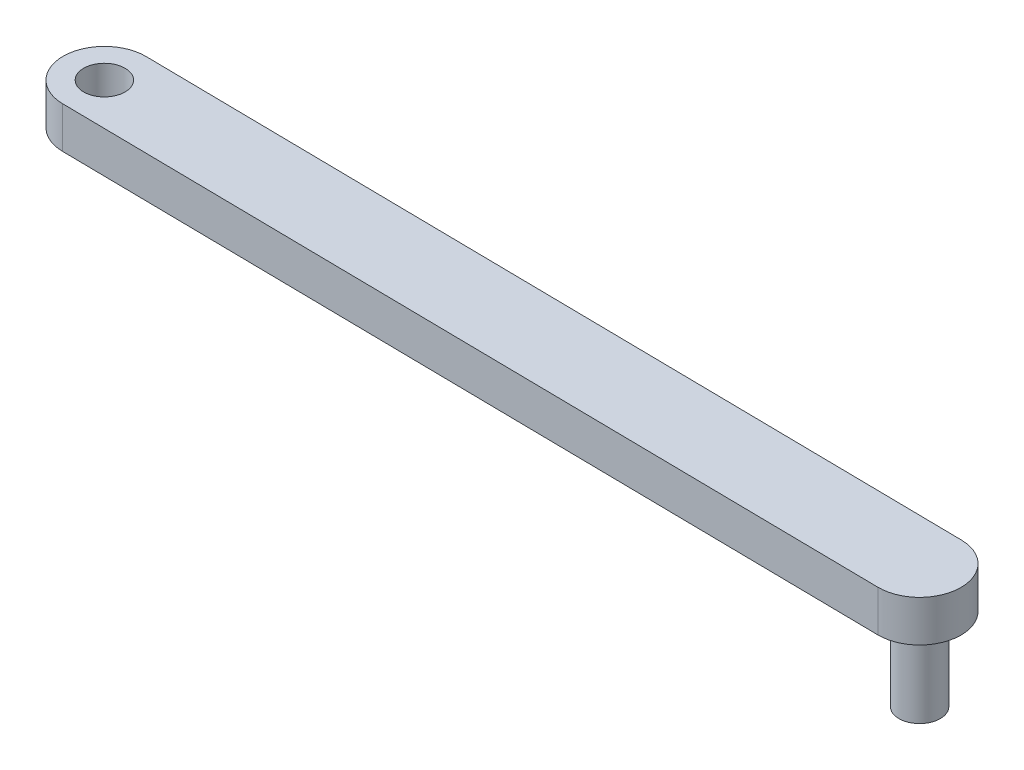
ISO-10303-21;
HEADER;
FILE_DESCRIPTION(('STEP AP214'),'2;1');
FILE_NAME('part.step','',(''),(''),'','','');
FILE_SCHEMA(('AUTOMOTIVE_DESIGN { 1 0 10303 214 1 1 1 1 }'));
ENDSEC;
DATA;
#1=APPLICATION_CONTEXT('core data for automotive mechanical design processes');
#2=APPLICATION_PROTOCOL_DEFINITION('international standard','automotive_design',2000,#1);
#3=PRODUCT_CONTEXT('',#1,'mechanical');
#4=PRODUCT('Part','Part','',(#3));
#5=PRODUCT_RELATED_PRODUCT_CATEGORY('part','',(#4));
#6=PRODUCT_DEFINITION_FORMATION('','',#4);
#7=PRODUCT_DEFINITION_CONTEXT('part definition',#1,'design');
#8=PRODUCT_DEFINITION('design','',#6,#7);
#9=PRODUCT_DEFINITION_SHAPE('','',#8);
#10=(LENGTH_UNIT() NAMED_UNIT(*) SI_UNIT(.MILLI.,.METRE.));
#11=(NAMED_UNIT(*) PLANE_ANGLE_UNIT() SI_UNIT($,.RADIAN.));
#12=(NAMED_UNIT(*) SI_UNIT($,.STERADIAN.) SOLID_ANGLE_UNIT());
#13=UNCERTAINTY_MEASURE_WITH_UNIT(LENGTH_MEASURE(1.E-05),#10,'distance_accuracy_value','');
#14=(GEOMETRIC_REPRESENTATION_CONTEXT(3) GLOBAL_UNCERTAINTY_ASSIGNED_CONTEXT((#13)) GLOBAL_UNIT_ASSIGNED_CONTEXT((#10,
#11,#12)) REPRESENTATION_CONTEXT('',''));
#15=CARTESIAN_POINT('',(0.,0.,0.));
#16=DIRECTION('',(0.,0.,1.));
#17=DIRECTION('',(1.,0.,0.));
#18=AXIS2_PLACEMENT_3D('',#15,#16,#17);
#19=CARTESIAN_POINT('',(-14.5716160355899,5.,-1.70714880270089));
#20=DIRECTION('',(0.,1.,0.));
#21=DIRECTION('',(0.,0.,1.));
#22=AXIS2_PLACEMENT_3D('',#19,#20,#21);
#23=PLANE('',#22);
#24=CARTESIAN_POINT('',(-14.5716160355899,5.,-1.70714880270089));
#25=DIRECTION('',(0.,1.,0.));
#26=DIRECTION('',(0.,0.,1.));
#27=AXIS2_PLACEMENT_3D('',#24,#25,#26);
#28=CIRCLE('',#27,5.);
#29=CARTESIAN_POINT('',(-14.5044435953561,5.,-6.70669756866698));
#30=VERTEX_POINT('',#29);
#31=CARTESIAN_POINT('',(-14.6387884758236,5.,3.2923999632652));
#32=VERTEX_POINT('',#31);
#33=EDGE_CURVE('E86',#30,#32,#28,.T.);
#34=ORIENTED_EDGE('',*,*,#33,.T.);
#35=DIRECTION('',(0.999909753193218,0.,0.013434488046742));
#36=VECTOR('',#35,1.);
#37=CARTESIAN_POINT('',(-14.6387884758236,5.,3.2923999632652));
#38=LINE('',#37,#36);
#39=CARTESIAN_POINT('',(85.3612115241764,5.,4.63597002084679));
#40=VERTEX_POINT('',#39);
#41=EDGE_CURVE('E81',#32,#40,#38,.T.);
#42=ORIENTED_EDGE('',*,*,#41,.T.);
#43=CARTESIAN_POINT('',(85.4283839644101,5.,-0.363578745119304));
#44=DIRECTION('',(0.,1.,0.));
#45=DIRECTION('',(0.,0.,1.));
#46=AXIS2_PLACEMENT_3D('',#43,#44,#45);
#47=CIRCLE('',#46,5.);
#48=CARTESIAN_POINT('',(85.4955564046439,5.,-5.36312751108539));
#49=VERTEX_POINT('',#48);
#50=EDGE_CURVE('E84',#40,#49,#47,.T.);
#51=ORIENTED_EDGE('',*,*,#50,.T.);
#52=DIRECTION('',(-0.999909753193218,0.,-0.013434488046742));
#53=VECTOR('',#52,1.);
#54=CARTESIAN_POINT('',(-14.5044435953561,5.,-6.70669756866698));
#55=LINE('',#54,#53);
#56=EDGE_CURVE('E51',#49,#30,#55,.T.);
#57=ORIENTED_EDGE('',*,*,#56,.T.);
#58=EDGE_LOOP('',(#34,#42,#51,#57));
#59=FACE_BOUND('',#58,.T.);
#60=CARTESIAN_POINT('',(-14.5716160355899,5.,-1.70714880270089));
#61=DIRECTION('',(0.,1.,0.));
#62=DIRECTION('',(0.,0.,1.));
#63=AXIS2_PLACEMENT_3D('',#60,#61,#62);
#64=CIRCLE('',#63,2.5);
#65=CARTESIAN_POINT('',(-14.5716160355899,5.,0.792851197299112));
#66=VERTEX_POINT('',#65);
#67=EDGE_CURVE('E102',#66,#66,#64,.T.);
#68=ORIENTED_EDGE('',*,*,#67,.F.);
#69=EDGE_LOOP('',(#68));
#70=FACE_BOUND('',#69,.T.);
#71=ADVANCED_FACE('F33',(#59,#70),#23,.T.);
#72=CARTESIAN_POINT('',(-14.5716160355899,0.,-1.70714880270089));
#73=DIRECTION('',(0.,1.,0.));
#74=DIRECTION('',(0.,0.,1.));
#75=AXIS2_PLACEMENT_3D('',#72,#73,#74);
#76=PLANE('',#75);
#77=CARTESIAN_POINT('',(85.4283839644101,0.,-0.3635787451193));
#78=DIRECTION('',(0.,1.,0.));
#79=DIRECTION('',(0.,0.,1.));
#80=AXIS2_PLACEMENT_3D('',#77,#78,#79);
#81=CIRCLE('',#80,2.50000000000001);
#82=CARTESIAN_POINT('',(85.4283839644101,0.,2.13642125488071));
#83=VERTEX_POINT('',#82);
#84=EDGE_CURVE('E37',#83,#83,#81,.T.);
#85=ORIENTED_EDGE('',*,*,#84,.T.);
#86=EDGE_LOOP('',(#85));
#87=FACE_BOUND('',#86,.T.);
#88=CARTESIAN_POINT('',(-14.5716160355899,0.,-1.70714880270089));
#89=DIRECTION('',(0.,1.,0.));
#90=DIRECTION('',(0.,0.,1.));
#91=AXIS2_PLACEMENT_3D('',#88,#89,#90);
#92=CIRCLE('',#91,5.);
#93=CARTESIAN_POINT('',(-14.5044435953561,0.,-6.70669756866698));
#94=VERTEX_POINT('',#93);
#95=CARTESIAN_POINT('',(-14.6387884758236,0.,3.2923999632652));
#96=VERTEX_POINT('',#95);
#97=EDGE_CURVE('E99',#94,#96,#92,.T.);
#98=ORIENTED_EDGE('',*,*,#97,.F.);
#99=DIRECTION('',(-0.999909753193218,0.,-0.013434488046742));
#100=VECTOR('',#99,1.);
#101=CARTESIAN_POINT('',(-14.5044435953561,0.,-6.70669756866698));
#102=LINE('',#101,#100);
#103=CARTESIAN_POINT('',(85.4955564046439,0.,-5.36312751108539));
#104=VERTEX_POINT('',#103);
#105=EDGE_CURVE('E74',#104,#94,#102,.T.);
#106=ORIENTED_EDGE('',*,*,#105,.F.);
#107=CARTESIAN_POINT('',(85.4283839644101,0.,-0.363578745119304));
#108=DIRECTION('',(0.,1.,0.));
#109=DIRECTION('',(0.,0.,1.));
#110=AXIS2_PLACEMENT_3D('',#107,#108,#109);
#111=CIRCLE('',#110,5.);
#112=CARTESIAN_POINT('',(85.3612115241764,0.,4.63597002084679));
#113=VERTEX_POINT('',#112);
#114=EDGE_CURVE('E68',#113,#104,#111,.T.);
#115=ORIENTED_EDGE('',*,*,#114,.F.);
#116=DIRECTION('',(0.999909753193218,0.,0.013434488046742));
#117=VECTOR('',#116,1.);
#118=CARTESIAN_POINT('',(-14.6387884758236,0.,3.2923999632652));
#119=LINE('',#118,#117);
#120=EDGE_CURVE('E90',#96,#113,#119,.T.);
#121=ORIENTED_EDGE('',*,*,#120,.F.);
#122=EDGE_LOOP('',(#98,#106,#115,#121));
#123=FACE_BOUND('',#122,.T.);
#124=CARTESIAN_POINT('',(-14.5716160355899,0.,-1.70714880270089));
#125=DIRECTION('',(0.,1.,0.));
#126=DIRECTION('',(0.,0.,1.));
#127=AXIS2_PLACEMENT_3D('',#124,#125,#126);
#128=CIRCLE('',#127,2.5);
#129=CARTESIAN_POINT('',(-14.5716160355899,0.,0.792851197299112));
#130=VERTEX_POINT('',#129);
#131=EDGE_CURVE('E114',#130,#130,#128,.T.);
#132=ORIENTED_EDGE('',*,*,#131,.T.);
#133=EDGE_LOOP('',(#132));
#134=FACE_BOUND('',#133,.T.);
#135=ADVANCED_FACE('F110',(#87,#123,#134),#76,.F.);
#136=CARTESIAN_POINT('',(-14.5716160355899,5.,-1.70714880270089));
#137=DIRECTION('',(0.,-1.,0.));
#138=DIRECTION('',(0.,0.,-1.));
#139=AXIS2_PLACEMENT_3D('',#136,#137,#138);
#140=CYLINDRICAL_SURFACE('',#139,5.);
#141=ORIENTED_EDGE('',*,*,#97,.T.);
#142=DIRECTION('',(0.,-1.,0.));
#143=VECTOR('',#142,1.);
#144=CARTESIAN_POINT('',(-14.6387884758236,5.,3.2923999632652));
#145=LINE('',#144,#143);
#146=EDGE_CURVE('E11',#32,#96,#145,.T.);
#147=ORIENTED_EDGE('',*,*,#146,.F.);
#148=ORIENTED_EDGE('',*,*,#33,.F.);
#149=DIRECTION('',(0.,-1.,0.));
#150=VECTOR('',#149,1.);
#151=CARTESIAN_POINT('',(-14.5044435953561,5.,-6.70669756866698));
#152=LINE('',#151,#150);
#153=EDGE_CURVE('E95',#30,#94,#152,.T.);
#154=ORIENTED_EDGE('',*,*,#153,.T.);
#155=EDGE_LOOP('',(#141,#147,#148,#154));
#156=FACE_BOUND('',#155,.T.);
#157=ADVANCED_FACE('F35',(#156),#140,.T.);
#158=CARTESIAN_POINT('',(-14.6387884758236,5.,3.2923999632652));
#159=DIRECTION('',(0.013434488046742,0.,-0.999909753193218));
#160=DIRECTION('',(-0.999909753193218,0.,-0.013434488046742));
#161=AXIS2_PLACEMENT_3D('',#158,#159,#160);
#162=PLANE('',#161);
#163=ORIENTED_EDGE('',*,*,#120,.T.);
#164=DIRECTION('',(0.,-1.,0.));
#165=VECTOR('',#164,1.);
#166=CARTESIAN_POINT('',(85.3612115241764,5.,4.63597002084679));
#167=LINE('',#166,#165);
#168=EDGE_CURVE('E43',#40,#113,#167,.T.);
#169=ORIENTED_EDGE('',*,*,#168,.F.);
#170=ORIENTED_EDGE('',*,*,#41,.F.);
#171=ORIENTED_EDGE('',*,*,#146,.T.);
#172=EDGE_LOOP('',(#163,#169,#170,#171));
#173=FACE_BOUND('',#172,.T.);
#174=ADVANCED_FACE('F89',(#173),#162,.F.);
#175=CARTESIAN_POINT('',(85.4283839644101,5.,-0.363578745119304));
#176=DIRECTION('',(0.,-1.,0.));
#177=DIRECTION('',(0.,0.,-1.));
#178=AXIS2_PLACEMENT_3D('',#175,#176,#177);
#179=CYLINDRICAL_SURFACE('',#178,5.);
#180=ORIENTED_EDGE('',*,*,#114,.T.);
#181=DIRECTION('',(0.,-1.,0.));
#182=VECTOR('',#181,1.);
#183=CARTESIAN_POINT('',(85.4955564046439,5.,-5.36312751108539));
#184=LINE('',#183,#182);
#185=EDGE_CURVE('E91',#49,#104,#184,.T.);
#186=ORIENTED_EDGE('',*,*,#185,.F.);
#187=ORIENTED_EDGE('',*,*,#50,.F.);
#188=ORIENTED_EDGE('',*,*,#168,.T.);
#189=EDGE_LOOP('',(#180,#186,#187,#188));
#190=FACE_BOUND('',#189,.T.);
#191=ADVANCED_FACE('F93',(#190),#179,.T.);
#192=CARTESIAN_POINT('',(-14.5044435953561,5.,-6.70669756866698));
#193=DIRECTION('',(-0.013434488046742,0.,0.999909753193218));
#194=DIRECTION('',(0.999909753193218,0.,0.013434488046742));
#195=AXIS2_PLACEMENT_3D('',#192,#193,#194);
#196=PLANE('',#195);
#197=ORIENTED_EDGE('',*,*,#105,.T.);
#198=ORIENTED_EDGE('',*,*,#153,.F.);
#199=ORIENTED_EDGE('',*,*,#56,.F.);
#200=ORIENTED_EDGE('',*,*,#185,.T.);
#201=EDGE_LOOP('',(#197,#198,#199,#200));
#202=FACE_BOUND('',#201,.T.);
#203=ADVANCED_FACE('F107',(#202),#196,.F.);
#204=CARTESIAN_POINT('',(-14.5716160355899,5.,-1.70714880270089));
#205=DIRECTION('',(0.,-1.,0.));
#206=DIRECTION('',(0.,0.,-1.));
#207=AXIS2_PLACEMENT_3D('',#204,#205,#206);
#208=CYLINDRICAL_SURFACE('',#207,2.5);
#209=ORIENTED_EDGE('',*,*,#67,.T.);
#210=EDGE_LOOP('',(#209));
#211=FACE_BOUND('',#210,.T.);
#212=ORIENTED_EDGE('',*,*,#131,.F.);
#213=EDGE_LOOP('',(#212));
#214=FACE_BOUND('',#213,.T.);
#215=ADVANCED_FACE('F130',(#211,#214),#208,.F.);
#216=CARTESIAN_POINT('',(85.4283839644101,-10.,-0.3635787451193));
#217=DIRECTION('',(0.,1.,0.));
#218=DIRECTION('',(0.,0.,1.));
#219=AXIS2_PLACEMENT_3D('',#216,#217,#218);
#220=CYLINDRICAL_SURFACE('',#219,2.50000000000001);
#221=CARTESIAN_POINT('',(85.4283839644101,-10.,-0.3635787451193));
#222=DIRECTION('',(0.,1.,0.));
#223=DIRECTION('',(0.,0.,1.));
#224=AXIS2_PLACEMENT_3D('',#221,#222,#223);
#225=CIRCLE('',#224,2.50000000000001);
#226=CARTESIAN_POINT('',(85.4283839644101,-10.,2.13642125488071));
#227=VERTEX_POINT('',#226);
#228=EDGE_CURVE('E119',#227,#227,#225,.T.);
#229=ORIENTED_EDGE('',*,*,#228,.T.);
#230=EDGE_LOOP('',(#229));
#231=FACE_BOUND('',#230,.T.);
#232=ORIENTED_EDGE('',*,*,#84,.F.);
#233=EDGE_LOOP('',(#232));
#234=FACE_BOUND('',#233,.T.);
#235=ADVANCED_FACE('F127',(#231,#234),#220,.T.);
#236=CARTESIAN_POINT('',(85.4283839644101,-10.,-0.3635787451193));
#237=DIRECTION('',(0.,1.,0.));
#238=DIRECTION('',(0.,0.,1.));
#239=AXIS2_PLACEMENT_3D('',#236,#237,#238);
#240=PLANE('',#239);
#241=ORIENTED_EDGE('',*,*,#228,.F.);
#242=EDGE_LOOP('',(#241));
#243=FACE_BOUND('',#242,.T.);
#244=ADVANCED_FACE('F129',(#243),#240,.F.);
#245=CLOSED_SHELL('',(#71,#135,#157,#174,#191,#203,#215,#235,#244));
#246=MANIFOLD_SOLID_BREP('B2',#245);
#247=ADVANCED_BREP_SHAPE_REPRESENTATION('',(#18,#246),#14);
#248=SHAPE_DEFINITION_REPRESENTATION(#9,#247);
ENDSEC;
END-ISO-10303-21;
